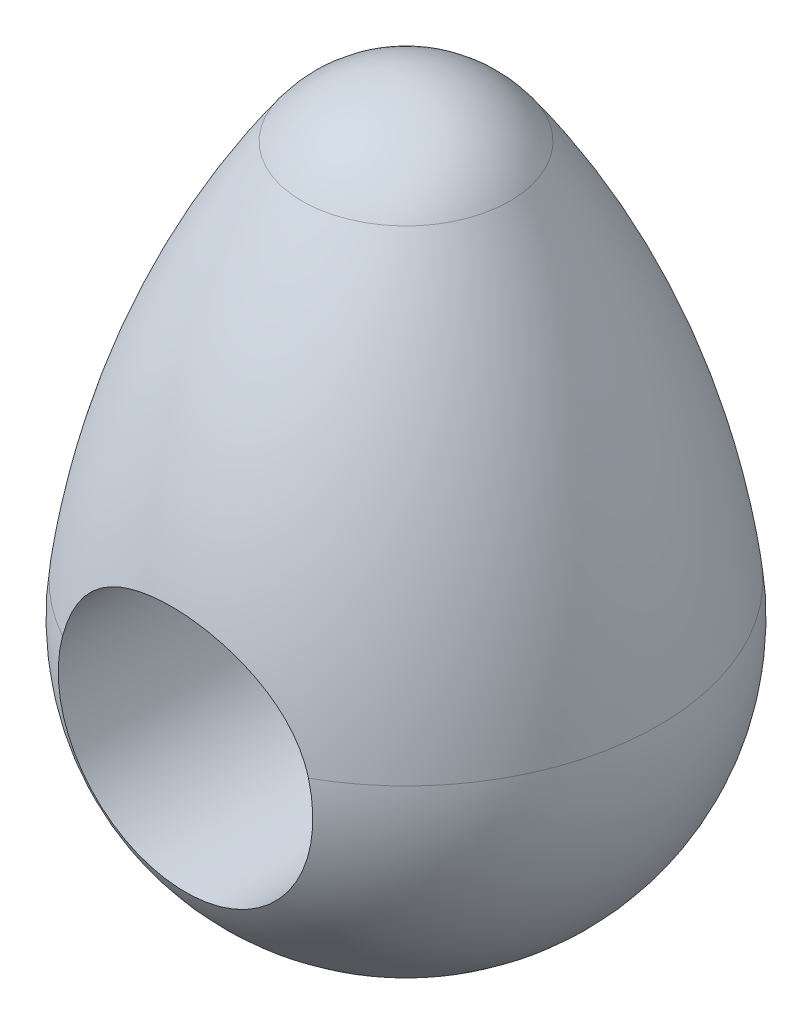
ISO-10303-21;
HEADER;
FILE_DESCRIPTION(('STEP AP214'),'2;1');
FILE_NAME('part.step','',(''),(''),'','','');
FILE_SCHEMA(('AUTOMOTIVE_DESIGN { 1 0 10303 214 1 1 1 1 }'));
ENDSEC;
DATA;
#1=APPLICATION_CONTEXT('core data for automotive mechanical design processes');
#2=APPLICATION_PROTOCOL_DEFINITION('international standard','automotive_design',2000,#1);
#3=PRODUCT_CONTEXT('',#1,'mechanical');
#4=PRODUCT('Part','Part','',(#3));
#5=PRODUCT_RELATED_PRODUCT_CATEGORY('part','',(#4));
#6=PRODUCT_DEFINITION_FORMATION('','',#4);
#7=PRODUCT_DEFINITION_CONTEXT('part definition',#1,'design');
#8=PRODUCT_DEFINITION('design','',#6,#7);
#9=PRODUCT_DEFINITION_SHAPE('','',#8);
#10=(LENGTH_UNIT() NAMED_UNIT(*) SI_UNIT(.MILLI.,.METRE.));
#11=(NAMED_UNIT(*) PLANE_ANGLE_UNIT() SI_UNIT($,.RADIAN.));
#12=(NAMED_UNIT(*) SI_UNIT($,.STERADIAN.) SOLID_ANGLE_UNIT());
#13=UNCERTAINTY_MEASURE_WITH_UNIT(LENGTH_MEASURE(1.E-05),#10,'distance_accuracy_value','');
#14=(GEOMETRIC_REPRESENTATION_CONTEXT(3) GLOBAL_UNCERTAINTY_ASSIGNED_CONTEXT((#13)) GLOBAL_UNIT_ASSIGNED_CONTEXT((#10,
#11,#12)) REPRESENTATION_CONTEXT('',''));
#15=CARTESIAN_POINT('',(0.,0.,0.));
#16=DIRECTION('',(0.,0.,1.));
#17=DIRECTION('',(1.,0.,0.));
#18=AXIS2_PLACEMENT_3D('',#15,#16,#17);
#19=CARTESIAN_POINT('',(0.,-11.509375,0.));
#20=DIRECTION('',(0.,-1.,0.));
#21=DIRECTION('',(0.,0.,-1.));
#22=AXIS2_PLACEMENT_3D('',#19,#20,#21);
#23=DEGENERATE_TOROIDAL_SURFACE('',#22,88.1518252057742,127.,.F.);
#24=CARTESIAN_POINT('',(0.,4.9325892857143,0.));
#25=DIRECTION('',(0.,-1.,0.));
#26=DIRECTION('',(0.,0.,-1.));
#27=AXIS2_PLACEMENT_3D('',#24,#25,#26);
#28=CIRCLE('',#27,37.7793536596175);
#29=CARTESIAN_POINT('',(-18.4003277943208,4.9325892857143,32.9955678841871));
#30=VERTEX_POINT('',#29);
#31=CARTESIAN_POINT('',(-18.4003277943208,4.9325892857143,-32.9955678841871));
#32=VERTEX_POINT('',#31);
#33=EDGE_CURVE('E83',#30,#32,#28,.T.);
#34=ORIENTED_EDGE('',*,*,#33,.F.);
#35=CARTESIAN_POINT('',(-18.4003814073016,4.93238928571426,32.9955678846186));
#36=CARTESIAN_POINT('',(-18.3325692378468,5.18536728713451,32.9955632520456));
#37=CARTESIAN_POINT('',(-18.2595467511235,5.4369112132228,32.9976376915696));
#38=CARTESIAN_POINT('',(-18.1032197433763,5.93670794981395,33.0057804716793));
#39=CARTESIAN_POINT('',(-18.019915615175,6.18496088565205,33.0118486597171));
#40=CARTESIAN_POINT('',(-17.7548887517165,6.92387522215487,33.0357879496352));
#41=CARTESIAN_POINT('',(-17.5579679688402,7.40900365058439,33.0593941774615));
#42=CARTESIAN_POINT('',(-17.1258873972779,8.35932467890845,33.1200474514089));
#43=CARTESIAN_POINT('',(-16.8908343786673,8.82456848781713,33.1570573141032));
#44=CARTESIAN_POINT('',(-16.3839029208377,9.73349869727594,33.2424019097334));
#45=CARTESIAN_POINT('',(-16.1120217148769,10.1771834747838,33.290737493721));
#46=CARTESIAN_POINT('',(-15.5337725359616,11.0396425477774,33.3962994988974));
#47=CARTESIAN_POINT('',(-15.2274414981497,11.4584428002188,33.45351642259));
#48=CARTESIAN_POINT('',(-14.5821748418402,12.2691102481379,33.5743654112764));
#49=CARTESIAN_POINT('',(-14.2432396085553,12.6609777617272,33.6379974004779));
#50=CARTESIAN_POINT('',(-13.5347390941466,13.4157148831882,33.769150833754));
#51=CARTESIAN_POINT('',(-13.165155171789,13.7785665755304,33.8366746371919));
#52=CARTESIAN_POINT('',(-12.397814102188,14.4728865180419,33.9730224091488));
#53=CARTESIAN_POINT('',(-12.0000562539283,14.8043539868373,34.0418464099878));
#54=CARTESIAN_POINT('',(-11.1639034560396,15.4452959077193,34.1807800736985));
#55=CARTESIAN_POINT('',(-10.7245594835262,15.7535429527428,34.2508463374984));
#56=CARTESIAN_POINT('',(-9.82099177300171,16.3321286712957,34.3870912951736));
#57=CARTESIAN_POINT('',(-9.35676744873763,16.6024664510297,34.4532698973673));
#58=CARTESIAN_POINT('',(-8.40650321143631,17.1032632619991,34.5793119277008));
#59=CARTESIAN_POINT('',(-7.92046521993052,17.3337257971323,34.639175910535));
#60=CARTESIAN_POINT('',(-6.92980876009836,17.7530147570815,34.7504269979082));
#61=CARTESIAN_POINT('',(-6.42519061977222,17.9418419164868,34.8018142520013));
#62=CARTESIAN_POINT('',(-5.40329487361848,18.2755149356398,34.8940413904054));
#63=CARTESIAN_POINT('',(-4.88608739441803,18.4205620742132,34.9349294112518));
#64=CARTESIAN_POINT('',(-3.84050403657985,18.6665866702841,35.0050037534114));
#65=CARTESIAN_POINT('',(-3.31212815303504,18.7675641084183,35.0341900695832));
#66=CARTESIAN_POINT('',(-2.24831348498065,18.9244972415352,35.0798034688701));
#67=CARTESIAN_POINT('',(-1.71287645793995,18.9804639321742,35.0962336681376));
#68=CARTESIAN_POINT('',(-0.638951163494651,19.0468802669719,35.1157513304852));
#69=CARTESIAN_POINT('',(-0.100462989147102,19.0573312919118,35.1188391983236));
#70=CARTESIAN_POINT('',(0.955248877682508,19.033084081467,35.1116997184402));
#71=CARTESIAN_POINT('',(1.4725152062761,19.000058501673,35.1019656547779));
#72=CARTESIAN_POINT('',(2.50225904045698,18.8920405387348,35.070362151926));
#73=CARTESIAN_POINT('',(3.01473667336062,18.8170492745722,35.0484930363081));
#74=CARTESIAN_POINT('',(4.0313036194904,18.6257513176979,34.9933500761006));
#75=CARTESIAN_POINT('',(4.53539267606179,18.5094433632953,34.9600758832343));
#76=CARTESIAN_POINT('',(5.53171919029678,18.2364851005572,34.8832311244394));
#77=CARTESIAN_POINT('',(6.02395648963526,18.0798342536161,34.8396604210459));
#78=CARTESIAN_POINT('',(6.99394676775984,17.7272068868756,34.7436071647194));
#79=CARTESIAN_POINT('',(7.47168043673932,17.5311803773775,34.6911132964674));
#80=CARTESIAN_POINT('',(8.40897393423809,17.1013883513432,34.5789973726089));
#81=CARTESIAN_POINT('',(8.86853378789944,16.867622887018,34.5193753268641));
#82=CARTESIAN_POINT('',(9.76681144446945,16.3638969110162,34.394974499692));
#83=CARTESIAN_POINT('',(10.2055231736492,16.0939259380061,34.3301942300375));
#84=CARTESIAN_POINT('',(11.0593447365764,15.5196058603114,34.1976866520269));
#85=CARTESIAN_POINT('',(11.4744540283124,15.2152559666206,34.1299592760558));
#86=CARTESIAN_POINT('',(12.2941217447092,14.561667777124,33.9912817128084));
#87=CARTESIAN_POINT('',(12.6976642451539,14.211155225064,33.9203075755617));
#88=CARTESIAN_POINT('',(13.2798614301843,13.6608620058197,33.8154466504689));
#89=CARTESIAN_POINT('',(13.47008600651,13.4733305521061,33.7807575202585));
#90=CARTESIAN_POINT('',(13.8426124724727,13.0903006341814,33.7122478838022));
#91=CARTESIAN_POINT('',(14.0249121451749,12.894799969902,33.6784276216844));
#92=CARTESIAN_POINT('',(14.5591037271091,12.2971661832145,33.5788658017229));
#93=CARTESIAN_POINT('',(14.8986501601278,11.8835591330501,33.5149569119623));
#94=CARTESIAN_POINT('',(15.5421718276563,11.0285851730212,33.3948874518236));
#95=CARTESIAN_POINT('',(15.8461501795282,10.5872207011753,33.3387262023268));
#96=CARTESIAN_POINT('',(16.3828145941636,9.73291203723231,33.2428423958318));
#97=CARTESIAN_POINT('',(16.6196807030292,9.32272024088869,33.2019637466421));
#98=CARTESIAN_POINT('',(17.0624787785542,8.48520307036341,33.1300876027153));
#99=CARTESIAN_POINT('',(17.2684153127407,8.05788023784016,33.0990886482335));
#100=CARTESIAN_POINT('',(17.6483481944515,7.18776263017201,33.0484742690229));
#101=CARTESIAN_POINT('',(17.8222954662588,6.74494530283764,33.0288762367966));
#102=CARTESIAN_POINT('',(18.0580787278608,6.07164981471703,33.0090330330041));
#103=CARTESIAN_POINT('',(18.1325008231787,5.84564197033815,33.004010872121));
#104=CARTESIAN_POINT('',(18.2728433533698,5.39094627461883,32.9972765430654));
#105=CARTESIAN_POINT('',(18.3387635409758,5.16225834554244,32.9955644711424));
#106=CARTESIAN_POINT('',(18.4003814073016,4.93238928571426,32.9955678846186));
#107=B_SPLINE_CURVE_WITH_KNOTS('',3,(#35,#36,#37,#38,#39,#40,#41,#42,#43,#44,#45,#46,#47,#48,
#49,#50,#51,#52,#53,#54,#55,#56,#57,#58,#59,#60,#61,#62,#63,#64,#65,#66,#67,#68,#69,#70,#71,#72,
#73,#74,#75,#76,#77,#78,#79,#80,#81,#82,#83,#84,#85,#86,#87,#88,#89,#90,#91,#92,#93,#94,#95,#96,
#97,#98,#99,#100,#101,#102,#103,#104,#105,#106),.UNSPECIFIED.,.F.,.F.,(4,2,2,2,2,2,2,2,2,2,2,2,
2,2,2,2,2,2,2,2,2,2,2,2,2,2,2,2,2,2,2,2,2,2,2,4),(0.,0.785592608663274,1.57115521208649,
3.1413162391811,4.70715438824782,6.27311023724102,7.83740288229302,9.40167704778164,
10.9669097186132,12.5321813488452,14.1540099698482,15.7758768226412,17.3976010870874,
19.0192967365233,20.6334189032943,22.2475417792797,23.861270222001,25.4749497096791,
27.0283251669249,28.5816592066206,30.1350406846731,31.6884429025208,33.2438298633424,
34.7992146723339,36.3550498712952,37.9109207843802,39.5264882603317,40.334376992754,
41.1424902907502,42.7572143057528,44.3717966921945,45.7967044552762,47.2214015876713,
48.6482664837128,49.3620980385694,50.0759503496332),.UNSPECIFIED.);
#108=CARTESIAN_POINT('',(18.4003277943208,4.9325892857143,32.9955678841871));
#109=VERTEX_POINT('',#108);
#110=EDGE_CURVE('E62',#30,#109,#107,.T.);
#111=ORIENTED_EDGE('',*,*,#110,.T.);
#112=CARTESIAN_POINT('',(18.4003277943208,4.9325892857143,-32.9955678841871));
#113=VERTEX_POINT('',#112);
#114=EDGE_CURVE('E79',#113,#109,#28,.T.);
#115=ORIENTED_EDGE('',*,*,#114,.F.);
#116=CARTESIAN_POINT('',(18.4003814073016,4.93238928571426,-32.9955678846186));
#117=CARTESIAN_POINT('',(18.3325692378468,5.18536728713451,-32.9955632520456));
#118=CARTESIAN_POINT('',(18.2595467511235,5.4369112132228,-32.9976376915696));
#119=CARTESIAN_POINT('',(18.1032197433763,5.93670794981395,-33.0057804716793));
#120=CARTESIAN_POINT('',(18.019915615175,6.18496088565205,-33.0118486597171));
#121=CARTESIAN_POINT('',(17.7548887517165,6.92387522215487,-33.0357879496352));
#122=CARTESIAN_POINT('',(17.5579679688402,7.40900365058439,-33.0593941774615));
#123=CARTESIAN_POINT('',(17.1258873972779,8.35932467890845,-33.1200474514089));
#124=CARTESIAN_POINT('',(16.8908343786673,8.82456848781713,-33.1570573141032));
#125=CARTESIAN_POINT('',(16.3839029208377,9.73349869727594,-33.2424019097334));
#126=CARTESIAN_POINT('',(16.1120217148769,10.1771834747838,-33.290737493721));
#127=CARTESIAN_POINT('',(15.5337725359616,11.0396425477774,-33.3962994988974));
#128=CARTESIAN_POINT('',(15.2274414981497,11.4584428002188,-33.45351642259));
#129=CARTESIAN_POINT('',(14.5821748418402,12.2691102481379,-33.5743654112764));
#130=CARTESIAN_POINT('',(14.2432396085553,12.6609777617272,-33.6379974004779));
#131=CARTESIAN_POINT('',(13.5347390941466,13.4157148831882,-33.769150833754));
#132=CARTESIAN_POINT('',(13.165155171789,13.7785665755304,-33.8366746371919));
#133=CARTESIAN_POINT('',(12.397814102188,14.4728865180419,-33.9730224091488));
#134=CARTESIAN_POINT('',(12.0000562539283,14.8043539868373,-34.0418464099878));
#135=CARTESIAN_POINT('',(11.1639034560396,15.4452959077193,-34.1807800736985));
#136=CARTESIAN_POINT('',(10.7245594835262,15.7535429527428,-34.2508463374984));
#137=CARTESIAN_POINT('',(9.82099177300171,16.3321286712957,-34.3870912951736));
#138=CARTESIAN_POINT('',(9.35676744873763,16.6024664510297,-34.4532698973673));
#139=CARTESIAN_POINT('',(8.40650321143631,17.1032632619991,-34.5793119277008));
#140=CARTESIAN_POINT('',(7.92046521993052,17.3337257971323,-34.639175910535));
#141=CARTESIAN_POINT('',(6.92980876009836,17.7530147570815,-34.7504269979082));
#142=CARTESIAN_POINT('',(6.42519061977222,17.9418419164868,-34.8018142520013));
#143=CARTESIAN_POINT('',(5.40329487361848,18.2755149356398,-34.8940413904054));
#144=CARTESIAN_POINT('',(4.88608739441803,18.4205620742132,-34.9349294112518));
#145=CARTESIAN_POINT('',(3.84050403657985,18.6665866702841,-35.0050037534114));
#146=CARTESIAN_POINT('',(3.31212815303504,18.7675641084183,-35.0341900695832));
#147=CARTESIAN_POINT('',(2.24831348498065,18.9244972415352,-35.0798034688701));
#148=CARTESIAN_POINT('',(1.71287645793995,18.9804639321742,-35.0962336681376));
#149=CARTESIAN_POINT('',(0.638951163494651,19.0468802669719,-35.1157513304852));
#150=CARTESIAN_POINT('',(0.100462989147102,19.0573312919118,-35.1188391983236));
#151=CARTESIAN_POINT('',(-0.955248877682508,19.033084081467,-35.1116997184402));
#152=CARTESIAN_POINT('',(-1.4725152062761,19.000058501673,-35.1019656547779));
#153=CARTESIAN_POINT('',(-2.50225904045698,18.8920405387348,-35.070362151926));
#154=CARTESIAN_POINT('',(-3.01473667336062,18.8170492745722,-35.0484930363081));
#155=CARTESIAN_POINT('',(-4.0313036194904,18.6257513176979,-34.9933500761006));
#156=CARTESIAN_POINT('',(-4.53539267606179,18.5094433632953,-34.9600758832343));
#157=CARTESIAN_POINT('',(-5.53171919029678,18.2364851005572,-34.8832311244394));
#158=CARTESIAN_POINT('',(-6.02395648963526,18.0798342536161,-34.8396604210459));
#159=CARTESIAN_POINT('',(-6.99394676775984,17.7272068868756,-34.7436071647194));
#160=CARTESIAN_POINT('',(-7.47168043673932,17.5311803773775,-34.6911132964674));
#161=CARTESIAN_POINT('',(-8.40897393423809,17.1013883513432,-34.5789973726089));
#162=CARTESIAN_POINT('',(-8.86853378789944,16.867622887018,-34.5193753268641));
#163=CARTESIAN_POINT('',(-9.76681144446945,16.3638969110162,-34.394974499692));
#164=CARTESIAN_POINT('',(-10.2055231736492,16.0939259380061,-34.3301942300375));
#165=CARTESIAN_POINT('',(-11.0593447365764,15.5196058603114,-34.1976866520269));
#166=CARTESIAN_POINT('',(-11.4744540283124,15.2152559666206,-34.1299592760558));
#167=CARTESIAN_POINT('',(-12.2941217447092,14.561667777124,-33.9912817128084));
#168=CARTESIAN_POINT('',(-12.6976642451539,14.211155225064,-33.9203075755617));
#169=CARTESIAN_POINT('',(-13.2798614301843,13.6608620058197,-33.8154466504689));
#170=CARTESIAN_POINT('',(-13.47008600651,13.4733305521061,-33.7807575202585));
#171=CARTESIAN_POINT('',(-13.8426124724727,13.0903006341814,-33.7122478838022));
#172=CARTESIAN_POINT('',(-14.0249121451749,12.894799969902,-33.6784276216844));
#173=CARTESIAN_POINT('',(-14.5591037271091,12.2971661832145,-33.5788658017229));
#174=CARTESIAN_POINT('',(-14.8986501601278,11.8835591330501,-33.5149569119623));
#175=CARTESIAN_POINT('',(-15.5421718276563,11.0285851730212,-33.3948874518236));
#176=CARTESIAN_POINT('',(-15.8461501795282,10.5872207011753,-33.3387262023268));
#177=CARTESIAN_POINT('',(-16.3828145941636,9.73291203723231,-33.2428423958318));
#178=CARTESIAN_POINT('',(-16.6196807030292,9.32272024088869,-33.2019637466421));
#179=CARTESIAN_POINT('',(-17.0624787785542,8.48520307036341,-33.1300876027153));
#180=CARTESIAN_POINT('',(-17.2684153127407,8.05788023784016,-33.0990886482335));
#181=CARTESIAN_POINT('',(-17.6483481944515,7.18776263017201,-33.0484742690229));
#182=CARTESIAN_POINT('',(-17.8222954662588,6.74494530283764,-33.0288762367966));
#183=CARTESIAN_POINT('',(-18.0580787278608,6.07164981471703,-33.0090330330041));
#184=CARTESIAN_POINT('',(-18.1325008231787,5.84564197033815,-33.004010872121));
#185=CARTESIAN_POINT('',(-18.2728433533698,5.39094627461883,-32.9972765430654));
#186=CARTESIAN_POINT('',(-18.3387635409758,5.16225834554244,-32.9955644711424));
#187=CARTESIAN_POINT('',(-18.4003814073016,4.93238928571426,-32.9955678846186));
#188=B_SPLINE_CURVE_WITH_KNOTS('',3,(#116,#117,#118,#119,#120,#121,#122,#123,#124,#125,#126,
#127,#128,#129,#130,#131,#132,#133,#134,#135,#136,#137,#138,#139,#140,#141,#142,#143,#144,#145,
#146,#147,#148,#149,#150,#151,#152,#153,#154,#155,#156,#157,#158,#159,#160,#161,#162,#163,#164,
#165,#166,#167,#168,#169,#170,#171,#172,#173,#174,#175,#176,#177,#178,#179,#180,#181,#182,#183,
#184,#185,#186,#187),.UNSPECIFIED.,.F.,.F.,(4,2,2,2,2,2,2,2,2,2,2,2,2,2,2,2,2,2,2,2,2,2,2,2,2,2,
2,2,2,2,2,2,2,2,2,4),(0.,0.785592608663274,1.57115521208649,3.1413162391811,4.70715438824782,
6.27311023724102,7.83740288229302,9.40167704778164,10.9669097186132,12.5321813488452,
14.1540099698482,15.7758768226412,17.3976010870874,19.0192967365233,20.6334189032943,
22.2475417792797,23.861270222001,25.4749497096791,27.0283251669249,28.5816592066206,
30.1350406846731,31.6884429025208,33.2438298633424,34.7992146723339,36.3550498712952,
37.9109207843802,39.5264882603317,40.334376992754,41.1424902907502,42.7572143057528,
44.3717966921945,45.7967044552762,47.2214015876713,48.6482664837128,49.3620980385694,
50.0759503496332),.UNSPECIFIED.);
#189=EDGE_CURVE('E68',#113,#32,#188,.T.);
#190=ORIENTED_EDGE('',*,*,#189,.T.);
#191=EDGE_LOOP('',(#34,#111,#115,#190));
#192=FACE_BOUND('',#191,.T.);
#193=CARTESIAN_POINT('',(0.,61.7957720588235,0.));
#194=DIRECTION('',(0.,-1.,0.));
#195=DIRECTION('',(0.,0.,-1.));
#196=AXIS2_PLACEMENT_3D('',#193,#194,#195);
#197=CIRCLE('',#196,15.5562044480778);
#198=CARTESIAN_POINT('',(0.,61.7957720588235,-15.5562044480778));
#199=VERTEX_POINT('',#198);
#200=EDGE_CURVE('E88',#199,#199,#197,.T.);
#201=ORIENTED_EDGE('',*,*,#200,.T.);
#202=EDGE_LOOP('',(#201));
#203=FACE_BOUND('',#202,.T.);
#204=ADVANCED_FACE('F47',(#192,#203),#23,.F.);
#205=CARTESIAN_POINT('',(0.,0.,0.));
#206=DIRECTION('',(0.,-1.,0.));
#207=DIRECTION('',(-1.,0.,0.));
#208=AXIS2_PLACEMENT_3D('',#205,#206,#207);
#209=SPHERICAL_SURFACE('',#208,38.1);
#210=ORIENTED_EDGE('',*,*,#114,.T.);
#211=CARTESIAN_POINT('',(0.,0.,32.9955678841871));
#212=DIRECTION('',(0.,0.,-1.));
#213=DIRECTION('',(-1.,0.,0.));
#214=AXIS2_PLACEMENT_3D('',#211,#212,#213);
#215=CIRCLE('',#214,19.05);
#216=EDGE_CURVE('E11',#109,#30,#215,.T.);
#217=ORIENTED_EDGE('',*,*,#216,.T.);
#218=ORIENTED_EDGE('',*,*,#33,.T.);
#219=CARTESIAN_POINT('',(0.,0.,-32.9955678841871));
#220=DIRECTION('',(0.,0.,1.));
#221=DIRECTION('',(1.,0.,0.));
#222=AXIS2_PLACEMENT_3D('',#219,#220,#221);
#223=CIRCLE('',#222,19.05);
#224=EDGE_CURVE('E56',#32,#113,#223,.T.);
#225=ORIENTED_EDGE('',*,*,#224,.T.);
#226=EDGE_LOOP('',(#210,#217,#218,#225));
#227=FACE_BOUND('',#226,.T.);
#228=ADVANCED_FACE('F86',(#227),#209,.T.);
#229=CARTESIAN_POINT('',(0.,50.8,0.));
#230=DIRECTION('',(0.,-1.,0.));
#231=DIRECTION('',(-1.,0.,0.));
#232=AXIS2_PLACEMENT_3D('',#229,#230,#231);
#233=SPHERICAL_SURFACE('',#232,19.05);
#234=ORIENTED_EDGE('',*,*,#200,.F.);
#235=EDGE_LOOP('',(#234));
#236=FACE_BOUND('',#235,.T.);
#237=ADVANCED_FACE('F108',(#236),#233,.T.);
#238=CARTESIAN_POINT('',(0.,0.,-38.1));
#239=DIRECTION('',(0.,0.,1.));
#240=DIRECTION('',(1.,0.,0.));
#241=AXIS2_PLACEMENT_3D('',#238,#239,#240);
#242=CYLINDRICAL_SURFACE('',#241,19.05);
#243=ORIENTED_EDGE('',*,*,#224,.F.);
#244=ORIENTED_EDGE('',*,*,#189,.F.);
#245=EDGE_LOOP('',(#243,#244));
#246=FACE_BOUND('',#245,.T.);
#247=ORIENTED_EDGE('',*,*,#216,.F.);
#248=ORIENTED_EDGE('',*,*,#110,.F.);
#249=EDGE_LOOP('',(#247,#248));
#250=FACE_BOUND('',#249,.T.);
#251=ADVANCED_FACE('F73',(#246,#250),#242,.F.);
#252=CLOSED_SHELL('',(#204,#228,#237,#251));
#253=MANIFOLD_SOLID_BREP('B2',#252);
#254=ADVANCED_BREP_SHAPE_REPRESENTATION('',(#18,#253),#14);
#255=SHAPE_DEFINITION_REPRESENTATION(#9,#254);
ENDSEC;
END-ISO-10303-21;
